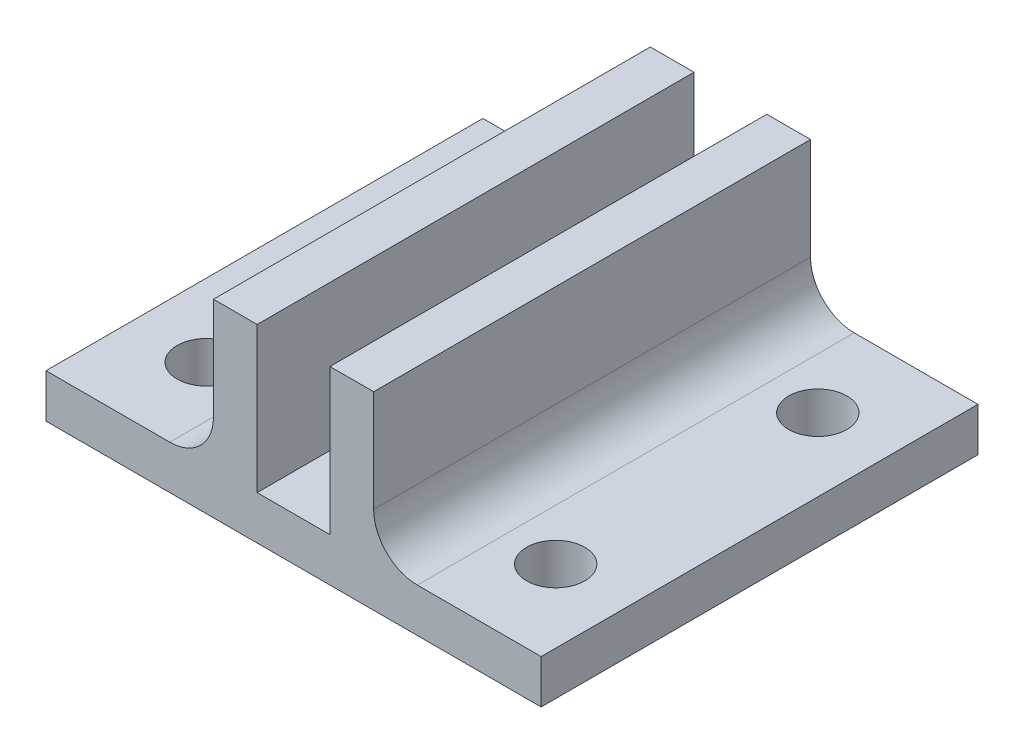
ISO-10303-21;
HEADER;
FILE_DESCRIPTION(('STEP AP214'),'2;1');
FILE_NAME('part.step','',(''),(''),'','','');
FILE_SCHEMA(('AUTOMOTIVE_DESIGN { 1 0 10303 214 1 1 1 1 }'));
ENDSEC;
DATA;
#1=APPLICATION_CONTEXT('core data for automotive mechanical design processes');
#2=APPLICATION_PROTOCOL_DEFINITION('international standard','automotive_design',2000,#1);
#3=PRODUCT_CONTEXT('',#1,'mechanical');
#4=PRODUCT('Part','Part','',(#3));
#5=PRODUCT_RELATED_PRODUCT_CATEGORY('part','',(#4));
#6=PRODUCT_DEFINITION_FORMATION('','',#4);
#7=PRODUCT_DEFINITION_CONTEXT('part definition',#1,'design');
#8=PRODUCT_DEFINITION('design','',#6,#7);
#9=PRODUCT_DEFINITION_SHAPE('','',#8);
#10=(LENGTH_UNIT() NAMED_UNIT(*) SI_UNIT(.MILLI.,.METRE.));
#11=(NAMED_UNIT(*) PLANE_ANGLE_UNIT() SI_UNIT($,.RADIAN.));
#12=(NAMED_UNIT(*) SI_UNIT($,.STERADIAN.) SOLID_ANGLE_UNIT());
#13=UNCERTAINTY_MEASURE_WITH_UNIT(LENGTH_MEASURE(1.E-05),#10,'distance_accuracy_value','');
#14=(GEOMETRIC_REPRESENTATION_CONTEXT(3) GLOBAL_UNCERTAINTY_ASSIGNED_CONTEXT((#13)) GLOBAL_UNIT_ASSIGNED_CONTEXT((#10,
#11,#12)) REPRESENTATION_CONTEXT('',''));
#15=CARTESIAN_POINT('',(0.,0.,0.));
#16=DIRECTION('',(0.,0.,1.));
#17=DIRECTION('',(1.,0.,0.));
#18=AXIS2_PLACEMENT_3D('',#15,#16,#17);
#19=CARTESIAN_POINT('',(11.5,3.,30.));
#20=DIRECTION('',(0.,-1.,0.));
#21=DIRECTION('',(0.,0.,-1.));
#22=AXIS2_PLACEMENT_3D('',#19,#20,#21);
#23=PLANE('',#22);
#24=CARTESIAN_POINT('',(5.,3.,6.));
#25=DIRECTION('',(0.,-1.,0.));
#26=DIRECTION('',(0.,0.,1.));
#27=AXIS2_PLACEMENT_3D('',#24,#25,#26);
#28=CIRCLE('',#27,2.);
#29=CARTESIAN_POINT('',(5.,3.,8.));
#30=VERTEX_POINT('',#29);
#31=EDGE_CURVE('E273',#30,#30,#28,.T.);
#32=ORIENTED_EDGE('',*,*,#31,.T.);
#33=EDGE_LOOP('',(#32));
#34=FACE_BOUND('',#33,.T.);
#35=CARTESIAN_POINT('',(5.,3.,24.));
#36=DIRECTION('',(0.,-1.,0.));
#37=DIRECTION('',(0.,0.,1.));
#38=AXIS2_PLACEMENT_3D('',#35,#36,#37);
#39=CIRCLE('',#38,2.);
#40=CARTESIAN_POINT('',(5.,3.,26.));
#41=VERTEX_POINT('',#40);
#42=EDGE_CURVE('E271',#41,#41,#39,.T.);
#43=ORIENTED_EDGE('',*,*,#42,.T.);
#44=EDGE_LOOP('',(#43));
#45=FACE_BOUND('',#44,.T.);
#46=DIRECTION('',(-1.,0.,0.));
#47=VECTOR('',#46,1.);
#48=CARTESIAN_POINT('',(11.5,3.,30.));
#49=LINE('',#48,#47);
#50=CARTESIAN_POINT('',(8.50000000000001,3.,30.));
#51=VERTEX_POINT('',#50);
#52=CARTESIAN_POINT('',(0.,3.,30.));
#53=VERTEX_POINT('',#52);
#54=EDGE_CURVE('E135',#51,#53,#49,.T.);
#55=ORIENTED_EDGE('',*,*,#54,.F.);
#56=DIRECTION('',(0.,0.,-1.));
#57=VECTOR('',#56,1.);
#58=CARTESIAN_POINT('',(8.50000000000001,3.,0.));
#59=LINE('',#58,#57);
#60=CARTESIAN_POINT('',(8.50000000000001,3.,0.));
#61=VERTEX_POINT('',#60);
#62=EDGE_CURVE('E161',#51,#61,#59,.T.);
#63=ORIENTED_EDGE('',*,*,#62,.T.);
#64=DIRECTION('',(-1.,0.,0.));
#65=VECTOR('',#64,1.);
#66=CARTESIAN_POINT('',(11.5,3.,0.));
#67=LINE('',#66,#65);
#68=CARTESIAN_POINT('',(0.,3.,0.));
#69=VERTEX_POINT('',#68);
#70=EDGE_CURVE('E159',#61,#69,#67,.T.);
#71=ORIENTED_EDGE('',*,*,#70,.T.);
#72=DIRECTION('',(0.,0.,-1.));
#73=VECTOR('',#72,1.);
#74=CARTESIAN_POINT('',(0.,3.,30.));
#75=LINE('',#74,#73);
#76=EDGE_CURVE('E152',#53,#69,#75,.T.);
#77=ORIENTED_EDGE('',*,*,#76,.F.);
#78=EDGE_LOOP('',(#55,#63,#71,#77));
#79=FACE_BOUND('',#78,.T.);
#80=ADVANCED_FACE('F35',(#34,#45,#79),#23,.F.);
#81=CARTESIAN_POINT('',(0.,3.,30.));
#82=DIRECTION('',(1.,0.,0.));
#83=DIRECTION('',(0.,0.,-1.));
#84=AXIS2_PLACEMENT_3D('',#81,#82,#83);
#85=PLANE('',#84);
#86=DIRECTION('',(0.,-1.,0.));
#87=VECTOR('',#86,1.);
#88=CARTESIAN_POINT('',(0.,3.,0.));
#89=LINE('',#88,#87);
#90=CARTESIAN_POINT('',(0.,0.,0.));
#91=VERTEX_POINT('',#90);
#92=EDGE_CURVE('E311',#69,#91,#89,.T.);
#93=ORIENTED_EDGE('',*,*,#92,.T.);
#94=DIRECTION('',(0.,0.,-1.));
#95=VECTOR('',#94,1.);
#96=CARTESIAN_POINT('',(0.,0.,30.));
#97=LINE('',#96,#95);
#98=CARTESIAN_POINT('',(0.,0.,30.));
#99=VERTEX_POINT('',#98);
#100=EDGE_CURVE('E154',#99,#91,#97,.T.);
#101=ORIENTED_EDGE('',*,*,#100,.F.);
#102=DIRECTION('',(0.,-1.,0.));
#103=VECTOR('',#102,1.);
#104=CARTESIAN_POINT('',(0.,3.,30.));
#105=LINE('',#104,#103);
#106=EDGE_CURVE('E139',#53,#99,#105,.T.);
#107=ORIENTED_EDGE('',*,*,#106,.F.);
#108=ORIENTED_EDGE('',*,*,#76,.T.);
#109=EDGE_LOOP('',(#93,#101,#107,#108));
#110=FACE_BOUND('',#109,.T.);
#111=ADVANCED_FACE('F151',(#110),#85,.F.);
#112=CARTESIAN_POINT('',(0.,0.,30.));
#113=DIRECTION('',(0.,1.,0.));
#114=DIRECTION('',(0.,0.,1.));
#115=AXIS2_PLACEMENT_3D('',#112,#113,#114);
#116=PLANE('',#115);
#117=CARTESIAN_POINT('',(5.,0.,6.));
#118=DIRECTION('',(0.,1.,0.));
#119=DIRECTION('',(0.,0.,1.));
#120=AXIS2_PLACEMENT_3D('',#117,#118,#119);
#121=CIRCLE('',#120,2.);
#122=CARTESIAN_POINT('',(5.,0.,8.));
#123=VERTEX_POINT('',#122);
#124=EDGE_CURVE('E276',#123,#123,#121,.T.);
#125=ORIENTED_EDGE('',*,*,#124,.T.);
#126=EDGE_LOOP('',(#125));
#127=FACE_BOUND('',#126,.T.);
#128=CARTESIAN_POINT('',(5.,0.,24.));
#129=DIRECTION('',(0.,1.,0.));
#130=DIRECTION('',(0.,0.,1.));
#131=AXIS2_PLACEMENT_3D('',#128,#129,#130);
#132=CIRCLE('',#131,2.);
#133=CARTESIAN_POINT('',(5.,0.,26.));
#134=VERTEX_POINT('',#133);
#135=EDGE_CURVE('E268',#134,#134,#132,.T.);
#136=ORIENTED_EDGE('',*,*,#135,.T.);
#137=EDGE_LOOP('',(#136));
#138=FACE_BOUND('',#137,.T.);
#139=CARTESIAN_POINT('',(29.,0.,6.));
#140=DIRECTION('',(0.,1.,0.));
#141=DIRECTION('',(0.,0.,1.));
#142=AXIS2_PLACEMENT_3D('',#139,#140,#141);
#143=CIRCLE('',#142,2.);
#144=CARTESIAN_POINT('',(29.,0.,8.));
#145=VERTEX_POINT('',#144);
#146=EDGE_CURVE('E282',#145,#145,#143,.F.);
#147=ORIENTED_EDGE('',*,*,#146,.F.);
#148=EDGE_LOOP('',(#147));
#149=FACE_BOUND('',#148,.T.);
#150=CARTESIAN_POINT('',(29.,0.,24.));
#151=DIRECTION('',(0.,1.,0.));
#152=DIRECTION('',(0.,0.,1.));
#153=AXIS2_PLACEMENT_3D('',#150,#151,#152);
#154=CIRCLE('',#153,2.);
#155=CARTESIAN_POINT('',(29.,0.,26.));
#156=VERTEX_POINT('',#155);
#157=EDGE_CURVE('E283',#156,#156,#154,.F.);
#158=ORIENTED_EDGE('',*,*,#157,.F.);
#159=EDGE_LOOP('',(#158));
#160=FACE_BOUND('',#159,.T.);
#161=DIRECTION('',(1.,0.,0.));
#162=VECTOR('',#161,1.);
#163=CARTESIAN_POINT('',(0.,0.,0.));
#164=LINE('',#163,#162);
#165=CARTESIAN_POINT('',(34.,0.,0.));
#166=VERTEX_POINT('',#165);
#167=EDGE_CURVE('E313',#91,#166,#164,.T.);
#168=ORIENTED_EDGE('',*,*,#167,.T.);
#169=DIRECTION('',(0.,0.,-1.));
#170=VECTOR('',#169,1.);
#171=CARTESIAN_POINT('',(34.,0.,30.));
#172=LINE('',#171,#170);
#173=CARTESIAN_POINT('',(34.,0.,30.));
#174=VERTEX_POINT('',#173);
#175=EDGE_CURVE('E165',#174,#166,#172,.T.);
#176=ORIENTED_EDGE('',*,*,#175,.F.);
#177=DIRECTION('',(1.,0.,0.));
#178=VECTOR('',#177,1.);
#179=CARTESIAN_POINT('',(0.,0.,30.));
#180=LINE('',#179,#178);
#181=EDGE_CURVE('E156',#99,#174,#180,.T.);
#182=ORIENTED_EDGE('',*,*,#181,.F.);
#183=ORIENTED_EDGE('',*,*,#100,.T.);
#184=EDGE_LOOP('',(#168,#176,#182,#183));
#185=FACE_BOUND('',#184,.T.);
#186=ADVANCED_FACE('F207',(#127,#138,#149,#160,#185),#116,.F.);
#187=CARTESIAN_POINT('',(34.,0.,30.));
#188=DIRECTION('',(-1.,0.,0.));
#189=DIRECTION('',(0.,0.,1.));
#190=AXIS2_PLACEMENT_3D('',#187,#188,#189);
#191=PLANE('',#190);
#192=DIRECTION('',(0.,1.,0.));
#193=VECTOR('',#192,1.);
#194=CARTESIAN_POINT('',(34.,0.,0.));
#195=LINE('',#194,#193);
#196=CARTESIAN_POINT('',(34.,3.,0.));
#197=VERTEX_POINT('',#196);
#198=EDGE_CURVE('E315',#166,#197,#195,.T.);
#199=ORIENTED_EDGE('',*,*,#198,.T.);
#200=DIRECTION('',(0.,0.,-1.));
#201=VECTOR('',#200,1.);
#202=CARTESIAN_POINT('',(34.,3.,30.));
#203=LINE('',#202,#201);
#204=CARTESIAN_POINT('',(34.,3.,30.));
#205=VERTEX_POINT('',#204);
#206=EDGE_CURVE('E346',#205,#197,#203,.T.);
#207=ORIENTED_EDGE('',*,*,#206,.F.);
#208=DIRECTION('',(0.,1.,0.));
#209=VECTOR('',#208,1.);
#210=CARTESIAN_POINT('',(34.,0.,30.));
#211=LINE('',#210,#209);
#212=EDGE_CURVE('E292',#174,#205,#211,.T.);
#213=ORIENTED_EDGE('',*,*,#212,.F.);
#214=ORIENTED_EDGE('',*,*,#175,.T.);
#215=EDGE_LOOP('',(#199,#207,#213,#214));
#216=FACE_BOUND('',#215,.T.);
#217=ADVANCED_FACE('F214',(#216),#191,.F.);
#218=CARTESIAN_POINT('',(34.,3.,30.));
#219=DIRECTION('',(0.,-1.,0.));
#220=DIRECTION('',(0.,0.,-1.));
#221=AXIS2_PLACEMENT_3D('',#218,#219,#220);
#222=PLANE('',#221);
#223=CARTESIAN_POINT('',(29.,3.,6.));
#224=DIRECTION('',(0.,1.,0.));
#225=DIRECTION('',(0.,0.,1.));
#226=AXIS2_PLACEMENT_3D('',#223,#224,#225);
#227=CIRCLE('',#226,2.);
#228=CARTESIAN_POINT('',(29.,3.,8.));
#229=VERTEX_POINT('',#228);
#230=EDGE_CURVE('E279',#229,#229,#227,.T.);
#231=ORIENTED_EDGE('',*,*,#230,.F.);
#232=EDGE_LOOP('',(#231));
#233=FACE_BOUND('',#232,.T.);
#234=CARTESIAN_POINT('',(29.,3.,24.));
#235=DIRECTION('',(0.,1.,0.));
#236=DIRECTION('',(0.,0.,1.));
#237=AXIS2_PLACEMENT_3D('',#234,#235,#236);
#238=CIRCLE('',#237,2.);
#239=CARTESIAN_POINT('',(29.,3.,26.));
#240=VERTEX_POINT('',#239);
#241=EDGE_CURVE('E286',#240,#240,#238,.T.);
#242=ORIENTED_EDGE('',*,*,#241,.F.);
#243=EDGE_LOOP('',(#242));
#244=FACE_BOUND('',#243,.T.);
#245=DIRECTION('',(-1.,0.,0.));
#246=VECTOR('',#245,1.);
#247=CARTESIAN_POINT('',(34.,3.,0.));
#248=LINE('',#247,#246);
#249=CARTESIAN_POINT('',(25.5,3.,0.));
#250=VERTEX_POINT('',#249);
#251=EDGE_CURVE('E317',#197,#250,#248,.T.);
#252=ORIENTED_EDGE('',*,*,#251,.T.);
#253=DIRECTION('',(0.,0.,-1.));
#254=VECTOR('',#253,1.);
#255=CARTESIAN_POINT('',(25.5,3.,30.));
#256=LINE('',#255,#254);
#257=CARTESIAN_POINT('',(25.5,3.,30.));
#258=VERTEX_POINT('',#257);
#259=EDGE_CURVE('E50',#250,#258,#256,.F.);
#260=ORIENTED_EDGE('',*,*,#259,.T.);
#261=DIRECTION('',(-1.,0.,0.));
#262=VECTOR('',#261,1.);
#263=CARTESIAN_POINT('',(34.,3.,30.));
#264=LINE('',#263,#262);
#265=EDGE_CURVE('E294',#205,#258,#264,.T.);
#266=ORIENTED_EDGE('',*,*,#265,.F.);
#267=ORIENTED_EDGE('',*,*,#206,.T.);
#268=EDGE_LOOP('',(#252,#260,#266,#267));
#269=FACE_BOUND('',#268,.T.);
#270=ADVANCED_FACE('F218',(#233,#244,#269),#222,.F.);
#271=CARTESIAN_POINT('',(22.5,3.,30.));
#272=DIRECTION('',(-1.,0.,0.));
#273=DIRECTION('',(0.,0.,1.));
#274=AXIS2_PLACEMENT_3D('',#271,#272,#273);
#275=PLANE('',#274);
#276=DIRECTION('',(0.,1.,0.));
#277=VECTOR('',#276,1.);
#278=CARTESIAN_POINT('',(22.5,3.,30.));
#279=LINE('',#278,#277);
#280=CARTESIAN_POINT('',(22.5,6.,30.));
#281=VERTEX_POINT('',#280);
#282=CARTESIAN_POINT('',(22.5,13.,30.));
#283=VERTEX_POINT('',#282);
#284=EDGE_CURVE('E296',#281,#283,#279,.T.);
#285=ORIENTED_EDGE('',*,*,#284,.F.);
#286=DIRECTION('',(0.,0.,-1.));
#287=VECTOR('',#286,1.);
#288=CARTESIAN_POINT('',(22.5,6.,0.));
#289=LINE('',#288,#287);
#290=CARTESIAN_POINT('',(22.5,6.,0.));
#291=VERTEX_POINT('',#290);
#292=EDGE_CURVE('E170',#281,#291,#289,.T.);
#293=ORIENTED_EDGE('',*,*,#292,.T.);
#294=DIRECTION('',(0.,1.,0.));
#295=VECTOR('',#294,1.);
#296=CARTESIAN_POINT('',(22.5,3.,0.));
#297=LINE('',#296,#295);
#298=CARTESIAN_POINT('',(22.5,13.,0.));
#299=VERTEX_POINT('',#298);
#300=EDGE_CURVE('E319',#291,#299,#297,.T.);
#301=ORIENTED_EDGE('',*,*,#300,.T.);
#302=DIRECTION('',(0.,0.,-1.));
#303=VECTOR('',#302,1.);
#304=CARTESIAN_POINT('',(22.5,13.,30.));
#305=LINE('',#304,#303);
#306=EDGE_CURVE('E343',#283,#299,#305,.T.);
#307=ORIENTED_EDGE('',*,*,#306,.F.);
#308=EDGE_LOOP('',(#285,#293,#301,#307));
#309=FACE_BOUND('',#308,.T.);
#310=ADVANCED_FACE('F222',(#309),#275,.F.);
#311=CARTESIAN_POINT('',(19.5,13.,30.));
#312=DIRECTION('',(0.,-1.,0.));
#313=DIRECTION('',(0.,0.,-1.));
#314=AXIS2_PLACEMENT_3D('',#311,#312,#313);
#315=PLANE('',#314);
#316=DIRECTION('',(-1.,0.,0.));
#317=VECTOR('',#316,1.);
#318=CARTESIAN_POINT('',(19.5,13.,0.));
#319=LINE('',#318,#317);
#320=CARTESIAN_POINT('',(19.5,13.,0.));
#321=VERTEX_POINT('',#320);
#322=EDGE_CURVE('E321',#299,#321,#319,.T.);
#323=ORIENTED_EDGE('',*,*,#322,.T.);
#324=DIRECTION('',(0.,0.,-1.));
#325=VECTOR('',#324,1.);
#326=CARTESIAN_POINT('',(19.5,13.,30.));
#327=LINE('',#326,#325);
#328=CARTESIAN_POINT('',(19.5,13.,30.));
#329=VERTEX_POINT('',#328);
#330=EDGE_CURVE('E340',#329,#321,#327,.T.);
#331=ORIENTED_EDGE('',*,*,#330,.F.);
#332=DIRECTION('',(-1.,0.,0.));
#333=VECTOR('',#332,1.);
#334=CARTESIAN_POINT('',(19.5,13.,30.));
#335=LINE('',#334,#333);
#336=EDGE_CURVE('E298',#283,#329,#335,.T.);
#337=ORIENTED_EDGE('',*,*,#336,.F.);
#338=ORIENTED_EDGE('',*,*,#306,.T.);
#339=EDGE_LOOP('',(#323,#331,#337,#338));
#340=FACE_BOUND('',#339,.T.);
#341=ADVANCED_FACE('F226',(#340),#315,.F.);
#342=CARTESIAN_POINT('',(19.5,13.,30.));
#343=DIRECTION('',(1.,0.,0.));
#344=DIRECTION('',(0.,0.,-1.));
#345=AXIS2_PLACEMENT_3D('',#342,#343,#344);
#346=PLANE('',#345);
#347=DIRECTION('',(0.,-1.,0.));
#348=VECTOR('',#347,1.);
#349=CARTESIAN_POINT('',(19.5,13.,0.));
#350=LINE('',#349,#348);
#351=CARTESIAN_POINT('',(19.5,3.,0.));
#352=VERTEX_POINT('',#351);
#353=EDGE_CURVE('E323',#321,#352,#350,.T.);
#354=ORIENTED_EDGE('',*,*,#353,.T.);
#355=DIRECTION('',(0.,0.,-1.));
#356=VECTOR('',#355,1.);
#357=CARTESIAN_POINT('',(19.5,3.,30.));
#358=LINE('',#357,#356);
#359=CARTESIAN_POINT('',(19.5,3.,30.));
#360=VERTEX_POINT('',#359);
#361=EDGE_CURVE('E337',#360,#352,#358,.T.);
#362=ORIENTED_EDGE('',*,*,#361,.F.);
#363=DIRECTION('',(0.,-1.,0.));
#364=VECTOR('',#363,1.);
#365=CARTESIAN_POINT('',(19.5,13.,30.));
#366=LINE('',#365,#364);
#367=EDGE_CURVE('E300',#329,#360,#366,.T.);
#368=ORIENTED_EDGE('',*,*,#367,.F.);
#369=ORIENTED_EDGE('',*,*,#330,.T.);
#370=EDGE_LOOP('',(#354,#362,#368,#369));
#371=FACE_BOUND('',#370,.T.);
#372=ADVANCED_FACE('F230',(#371),#346,.F.);
#373=CARTESIAN_POINT('',(19.5,3.,30.));
#374=DIRECTION('',(0.,-1.,0.));
#375=DIRECTION('',(0.,0.,-1.));
#376=AXIS2_PLACEMENT_3D('',#373,#374,#375);
#377=PLANE('',#376);
#378=DIRECTION('',(-1.,0.,0.));
#379=VECTOR('',#378,1.);
#380=CARTESIAN_POINT('',(19.5,3.,0.));
#381=LINE('',#380,#379);
#382=CARTESIAN_POINT('',(14.5,3.,0.));
#383=VERTEX_POINT('',#382);
#384=EDGE_CURVE('E325',#352,#383,#381,.T.);
#385=ORIENTED_EDGE('',*,*,#384,.T.);
#386=DIRECTION('',(0.,0.,-1.));
#387=VECTOR('',#386,1.);
#388=CARTESIAN_POINT('',(14.5,3.,30.));
#389=LINE('',#388,#387);
#390=CARTESIAN_POINT('',(14.5,3.,30.));
#391=VERTEX_POINT('',#390);
#392=EDGE_CURVE('E334',#391,#383,#389,.T.);
#393=ORIENTED_EDGE('',*,*,#392,.F.);
#394=DIRECTION('',(-1.,0.,0.));
#395=VECTOR('',#394,1.);
#396=CARTESIAN_POINT('',(19.5,3.,30.));
#397=LINE('',#396,#395);
#398=EDGE_CURVE('E302',#360,#391,#397,.T.);
#399=ORIENTED_EDGE('',*,*,#398,.F.);
#400=ORIENTED_EDGE('',*,*,#361,.T.);
#401=EDGE_LOOP('',(#385,#393,#399,#400));
#402=FACE_BOUND('',#401,.T.);
#403=ADVANCED_FACE('F234',(#402),#377,.F.);
#404=CARTESIAN_POINT('',(14.5,3.,30.));
#405=DIRECTION('',(-1.,0.,0.));
#406=DIRECTION('',(0.,0.,1.));
#407=AXIS2_PLACEMENT_3D('',#404,#405,#406);
#408=PLANE('',#407);
#409=DIRECTION('',(0.,1.,0.));
#410=VECTOR('',#409,1.);
#411=CARTESIAN_POINT('',(14.5,3.,0.));
#412=LINE('',#411,#410);
#413=CARTESIAN_POINT('',(14.5,13.,0.));
#414=VERTEX_POINT('',#413);
#415=EDGE_CURVE('E327',#383,#414,#412,.T.);
#416=ORIENTED_EDGE('',*,*,#415,.T.);
#417=DIRECTION('',(0.,0.,-1.));
#418=VECTOR('',#417,1.);
#419=CARTESIAN_POINT('',(14.5,13.,30.));
#420=LINE('',#419,#418);
#421=CARTESIAN_POINT('',(14.5,13.,30.));
#422=VERTEX_POINT('',#421);
#423=EDGE_CURVE('E331',#422,#414,#420,.T.);
#424=ORIENTED_EDGE('',*,*,#423,.F.);
#425=DIRECTION('',(0.,1.,0.));
#426=VECTOR('',#425,1.);
#427=CARTESIAN_POINT('',(14.5,3.,30.));
#428=LINE('',#427,#426);
#429=EDGE_CURVE('E304',#391,#422,#428,.T.);
#430=ORIENTED_EDGE('',*,*,#429,.F.);
#431=ORIENTED_EDGE('',*,*,#392,.T.);
#432=EDGE_LOOP('',(#416,#424,#430,#431));
#433=FACE_BOUND('',#432,.T.);
#434=ADVANCED_FACE('F238',(#433),#408,.F.);
#435=CARTESIAN_POINT('',(11.5,13.,30.));
#436=DIRECTION('',(0.,-1.,0.));
#437=DIRECTION('',(0.,0.,-1.));
#438=AXIS2_PLACEMENT_3D('',#435,#436,#437);
#439=PLANE('',#438);
#440=DIRECTION('',(-1.,0.,0.));
#441=VECTOR('',#440,1.);
#442=CARTESIAN_POINT('',(11.5,13.,0.));
#443=LINE('',#442,#441);
#444=CARTESIAN_POINT('',(11.5,13.,0.));
#445=VERTEX_POINT('',#444);
#446=EDGE_CURVE('E188',#414,#445,#443,.T.);
#447=ORIENTED_EDGE('',*,*,#446,.T.);
#448=DIRECTION('',(0.,0.,-1.));
#449=VECTOR('',#448,1.);
#450=CARTESIAN_POINT('',(11.5,13.,30.));
#451=LINE('',#450,#449);
#452=CARTESIAN_POINT('',(11.5,13.,30.));
#453=VERTEX_POINT('',#452);
#454=EDGE_CURVE('E187',#453,#445,#451,.T.);
#455=ORIENTED_EDGE('',*,*,#454,.F.);
#456=DIRECTION('',(-1.,0.,0.));
#457=VECTOR('',#456,1.);
#458=CARTESIAN_POINT('',(11.5,13.,30.));
#459=LINE('',#458,#457);
#460=EDGE_CURVE('E306',#422,#453,#459,.T.);
#461=ORIENTED_EDGE('',*,*,#460,.F.);
#462=ORIENTED_EDGE('',*,*,#423,.T.);
#463=EDGE_LOOP('',(#447,#455,#461,#462));
#464=FACE_BOUND('',#463,.T.);
#465=ADVANCED_FACE('F242',(#464),#439,.F.);
#466=CARTESIAN_POINT('',(11.5,3.,30.));
#467=DIRECTION('',(1.,0.,0.));
#468=DIRECTION('',(0.,0.,-1.));
#469=AXIS2_PLACEMENT_3D('',#466,#467,#468);
#470=PLANE('',#469);
#471=DIRECTION('',(0.,-1.,0.));
#472=VECTOR('',#471,1.);
#473=CARTESIAN_POINT('',(11.5,3.,0.));
#474=LINE('',#473,#472);
#475=CARTESIAN_POINT('',(11.5,6.,0.));
#476=VERTEX_POINT('',#475);
#477=EDGE_CURVE('E147',#445,#476,#474,.T.);
#478=ORIENTED_EDGE('',*,*,#477,.T.);
#479=DIRECTION('',(0.,0.,-1.));
#480=VECTOR('',#479,1.);
#481=CARTESIAN_POINT('',(11.5,6.,30.));
#482=LINE('',#481,#480);
#483=CARTESIAN_POINT('',(11.5,6.,30.));
#484=VERTEX_POINT('',#483);
#485=EDGE_CURVE('E163',#476,#484,#482,.F.);
#486=ORIENTED_EDGE('',*,*,#485,.T.);
#487=DIRECTION('',(0.,-1.,0.));
#488=VECTOR('',#487,1.);
#489=CARTESIAN_POINT('',(11.5,3.,30.));
#490=LINE('',#489,#488);
#491=EDGE_CURVE('E308',#453,#484,#490,.T.);
#492=ORIENTED_EDGE('',*,*,#491,.F.);
#493=ORIENTED_EDGE('',*,*,#454,.T.);
#494=EDGE_LOOP('',(#478,#486,#492,#493));
#495=FACE_BOUND('',#494,.T.);
#496=ADVANCED_FACE('F184',(#495),#470,.F.);
#497=CARTESIAN_POINT('',(0.,0.,30.));
#498=DIRECTION('',(0.,0.,1.));
#499=DIRECTION('',(1.,0.,0.));
#500=AXIS2_PLACEMENT_3D('',#497,#498,#499);
#501=PLANE('',#500);
#502=ORIENTED_EDGE('',*,*,#491,.T.);
#503=CARTESIAN_POINT('',(8.50000000000001,6.,30.));
#504=DIRECTION('',(0.,0.,1.));
#505=DIRECTION('',(1.,0.,0.));
#506=AXIS2_PLACEMENT_3D('',#503,#504,#505);
#507=CIRCLE('',#506,3.);
#508=EDGE_CURVE('E142',#484,#51,#507,.F.);
#509=ORIENTED_EDGE('',*,*,#508,.T.);
#510=ORIENTED_EDGE('',*,*,#54,.T.);
#511=ORIENTED_EDGE('',*,*,#106,.T.);
#512=ORIENTED_EDGE('',*,*,#181,.T.);
#513=ORIENTED_EDGE('',*,*,#212,.T.);
#514=ORIENTED_EDGE('',*,*,#265,.T.);
#515=CARTESIAN_POINT('',(25.5,6.,30.));
#516=DIRECTION('',(0.,0.,1.));
#517=DIRECTION('',(1.,0.,0.));
#518=AXIS2_PLACEMENT_3D('',#515,#516,#517);
#519=CIRCLE('',#518,3.);
#520=EDGE_CURVE('E11',#258,#281,#519,.F.);
#521=ORIENTED_EDGE('',*,*,#520,.T.);
#522=ORIENTED_EDGE('',*,*,#284,.T.);
#523=ORIENTED_EDGE('',*,*,#336,.T.);
#524=ORIENTED_EDGE('',*,*,#367,.T.);
#525=ORIENTED_EDGE('',*,*,#398,.T.);
#526=ORIENTED_EDGE('',*,*,#429,.T.);
#527=ORIENTED_EDGE('',*,*,#460,.T.);
#528=EDGE_LOOP('',(#502,#509,#510,#511,#512,#513,#514,#521,#522,#523,#524,#525,#526,#527));
#529=FACE_BOUND('',#528,.T.);
#530=ADVANCED_FACE('F138',(#529),#501,.T.);
#531=CARTESIAN_POINT('',(0.,0.,0.));
#532=DIRECTION('',(0.,0.,1.));
#533=DIRECTION('',(1.,0.,0.));
#534=AXIS2_PLACEMENT_3D('',#531,#532,#533);
#535=PLANE('',#534);
#536=ORIENTED_EDGE('',*,*,#70,.F.);
#537=CARTESIAN_POINT('',(8.50000000000001,6.,0.));
#538=DIRECTION('',(0.,0.,1.));
#539=DIRECTION('',(1.,0.,0.));
#540=AXIS2_PLACEMENT_3D('',#537,#538,#539);
#541=CIRCLE('',#540,3.);
#542=EDGE_CURVE('E174',#61,#476,#541,.T.);
#543=ORIENTED_EDGE('',*,*,#542,.T.);
#544=ORIENTED_EDGE('',*,*,#477,.F.);
#545=ORIENTED_EDGE('',*,*,#446,.F.);
#546=ORIENTED_EDGE('',*,*,#415,.F.);
#547=ORIENTED_EDGE('',*,*,#384,.F.);
#548=ORIENTED_EDGE('',*,*,#353,.F.);
#549=ORIENTED_EDGE('',*,*,#322,.F.);
#550=ORIENTED_EDGE('',*,*,#300,.F.);
#551=CARTESIAN_POINT('',(25.5,6.,0.));
#552=DIRECTION('',(0.,0.,1.));
#553=DIRECTION('',(1.,0.,0.));
#554=AXIS2_PLACEMENT_3D('',#551,#552,#553);
#555=CIRCLE('',#554,3.);
#556=EDGE_CURVE('E43',#291,#250,#555,.T.);
#557=ORIENTED_EDGE('',*,*,#556,.T.);
#558=ORIENTED_EDGE('',*,*,#251,.F.);
#559=ORIENTED_EDGE('',*,*,#198,.F.);
#560=ORIENTED_EDGE('',*,*,#167,.F.);
#561=ORIENTED_EDGE('',*,*,#92,.F.);
#562=EDGE_LOOP('',(#536,#543,#544,#545,#546,#547,#548,#549,#550,#557,#558,#559,#560,#561));
#563=FACE_BOUND('',#562,.T.);
#564=ADVANCED_FACE('F178',(#563),#535,.F.);
#565=CARTESIAN_POINT('',(29.,-5.65685424949237,24.));
#566=DIRECTION('',(0.,1.,0.));
#567=DIRECTION('',(0.,0.,1.));
#568=AXIS2_PLACEMENT_3D('',#565,#566,#567);
#569=CYLINDRICAL_SURFACE('',#568,2.);
#570=CARTESIAN_POINT('',(29.,0.,26.));
#571=CARTESIAN_POINT('',(29.,0.0312499999999992,26.));
#572=CARTESIAN_POINT('',(29.,0.0624999999999992,26.));
#573=CARTESIAN_POINT('',(29.,0.124999999999999,26.));
#574=CARTESIAN_POINT('',(29.,0.156249999999999,26.));
#575=CARTESIAN_POINT('',(29.,0.218749999999999,26.));
#576=CARTESIAN_POINT('',(29.,0.249999999999999,26.));
#577=CARTESIAN_POINT('',(29.,0.312499999999999,26.));
#578=CARTESIAN_POINT('',(29.,0.343749999999999,26.));
#579=CARTESIAN_POINT('',(29.,0.40625,26.));
#580=CARTESIAN_POINT('',(29.,0.4375,26.));
#581=CARTESIAN_POINT('',(29.,0.5,26.));
#582=CARTESIAN_POINT('',(29.,0.53125,26.));
#583=CARTESIAN_POINT('',(29.,0.59375,26.));
#584=CARTESIAN_POINT('',(29.,0.625,26.));
#585=CARTESIAN_POINT('',(29.,0.6875,26.));
#586=CARTESIAN_POINT('',(29.,0.71875,26.));
#587=CARTESIAN_POINT('',(29.,0.78125,26.));
#588=CARTESIAN_POINT('',(29.,0.8125,26.));
#589=CARTESIAN_POINT('',(29.,0.875,26.));
#590=CARTESIAN_POINT('',(29.,0.90625,26.));
#591=CARTESIAN_POINT('',(29.,0.96875,26.));
#592=CARTESIAN_POINT('',(29.,1.,26.));
#593=CARTESIAN_POINT('',(29.,1.0625,26.));
#594=CARTESIAN_POINT('',(29.,1.09375,26.));
#595=CARTESIAN_POINT('',(29.,1.15625,26.));
#596=CARTESIAN_POINT('',(29.,1.1875,26.));
#597=CARTESIAN_POINT('',(29.,1.25,26.));
#598=CARTESIAN_POINT('',(29.,1.28125,26.));
#599=CARTESIAN_POINT('',(29.,1.34375,26.));
#600=CARTESIAN_POINT('',(29.,1.375,26.));
#601=CARTESIAN_POINT('',(29.,1.4375,26.));
#602=CARTESIAN_POINT('',(29.,1.46875,26.));
#603=CARTESIAN_POINT('',(29.,1.53125,26.));
#604=CARTESIAN_POINT('',(29.,1.5625,26.));
#605=CARTESIAN_POINT('',(29.,1.625,26.));
#606=CARTESIAN_POINT('',(29.,1.65625,26.));
#607=CARTESIAN_POINT('',(29.,1.71875,26.));
#608=CARTESIAN_POINT('',(29.,1.75,26.));
#609=CARTESIAN_POINT('',(29.,1.8125,26.));
#610=CARTESIAN_POINT('',(29.,1.84375,26.));
#611=CARTESIAN_POINT('',(29.,1.90625,26.));
#612=CARTESIAN_POINT('',(29.,1.9375,26.));
#613=CARTESIAN_POINT('',(29.,2.,26.));
#614=CARTESIAN_POINT('',(29.,2.03125,26.));
#615=CARTESIAN_POINT('',(29.,2.09375,26.));
#616=CARTESIAN_POINT('',(29.,2.125,26.));
#617=CARTESIAN_POINT('',(29.,2.1875,26.));
#618=CARTESIAN_POINT('',(29.,2.21875,26.));
#619=CARTESIAN_POINT('',(29.,2.28125,26.));
#620=CARTESIAN_POINT('',(29.,2.3125,26.));
#621=CARTESIAN_POINT('',(29.,2.375,26.));
#622=CARTESIAN_POINT('',(29.,2.40625,26.));
#623=CARTESIAN_POINT('',(29.,2.46875,26.));
#624=CARTESIAN_POINT('',(29.,2.5,26.));
#625=CARTESIAN_POINT('',(29.,2.5625,26.));
#626=CARTESIAN_POINT('',(29.,2.59375,26.));
#627=CARTESIAN_POINT('',(29.,2.65625,26.));
#628=CARTESIAN_POINT('',(29.,2.6875,26.));
#629=CARTESIAN_POINT('',(29.,2.75,26.));
#630=CARTESIAN_POINT('',(29.,2.78125,26.));
#631=CARTESIAN_POINT('',(29.,2.84375,26.));
#632=CARTESIAN_POINT('',(29.,2.875,26.));
#633=CARTESIAN_POINT('',(29.,2.9375,26.));
#634=CARTESIAN_POINT('',(29.,2.96875,26.));
#635=CARTESIAN_POINT('',(29.,3.,26.));
#636=B_SPLINE_CURVE_WITH_KNOTS('',3,(#570,#571,#572,#573,#574,#575,#576,#577,#578,#579,#580,
#581,#582,#583,#584,#585,#586,#587,#588,#589,#590,#591,#592,#593,#594,#595,#596,#597,#598,#599,
#600,#601,#602,#603,#604,#605,#606,#607,#608,#609,#610,#611,#612,#613,#614,#615,#616,#617,#618,
#619,#620,#621,#622,#623,#624,#625,#626,#627,#628,#629,#630,#631,#632,#633,#634,#635),
.UNSPECIFIED.,.F.,.F.,(4,2,2,2,2,2,2,2,2,2,2,2,2,2,2,2,2,2,2,2,2,2,2,2,2,2,2,2,2,2,2,2,4),(0.,
0.0937500000000001,0.1875,0.28125,0.375,0.46875,0.5625,0.656250000000001,0.750000000000001,
0.843750000000001,0.937500000000001,1.03125,1.125,1.21875,1.3125,1.40625,1.5,1.59375,1.6875,
1.78125,1.875,1.96875,2.0625,2.15625,2.25,2.34375,2.4375,2.53125,2.625,2.71875,2.8125,2.90625,
3.),.UNSPECIFIED.);
#637=EDGE_CURVE('BSEAM251',#156,#240,#636,.T.);
#638=ORIENTED_EDGE('',*,*,#157,.T.);
#639=ORIENTED_EDGE('',*,*,#241,.T.);
#640=ORIENTED_EDGE('',*,*,#637,.T.);
#641=ORIENTED_EDGE('',*,*,#637,.F.);
#642=EDGE_LOOP('',(#638,#640,#639,#641));
#643=FACE_BOUND('',#642,.T.);
#644=ADVANCED_FACE('F251',(#643),#569,.F.);
#645=CARTESIAN_POINT('',(29.,-5.65685424949237,6.));
#646=DIRECTION('',(0.,1.,0.));
#647=DIRECTION('',(0.,0.,1.));
#648=AXIS2_PLACEMENT_3D('',#645,#646,#647);
#649=CYLINDRICAL_SURFACE('',#648,2.);
#650=CARTESIAN_POINT('',(29.,0.,8.));
#651=CARTESIAN_POINT('',(29.,0.0312499999999992,8.));
#652=CARTESIAN_POINT('',(29.,0.0624999999999992,8.));
#653=CARTESIAN_POINT('',(29.,0.124999999999999,8.));
#654=CARTESIAN_POINT('',(29.,0.156249999999999,8.));
#655=CARTESIAN_POINT('',(29.,0.218749999999999,8.));
#656=CARTESIAN_POINT('',(29.,0.249999999999999,8.));
#657=CARTESIAN_POINT('',(29.,0.312499999999999,8.));
#658=CARTESIAN_POINT('',(29.,0.343749999999999,8.));
#659=CARTESIAN_POINT('',(29.,0.40625,8.));
#660=CARTESIAN_POINT('',(29.,0.4375,8.));
#661=CARTESIAN_POINT('',(29.,0.5,8.));
#662=CARTESIAN_POINT('',(29.,0.53125,8.));
#663=CARTESIAN_POINT('',(29.,0.59375,8.));
#664=CARTESIAN_POINT('',(29.,0.625,8.));
#665=CARTESIAN_POINT('',(29.,0.6875,8.));
#666=CARTESIAN_POINT('',(29.,0.71875,8.));
#667=CARTESIAN_POINT('',(29.,0.78125,8.));
#668=CARTESIAN_POINT('',(29.,0.8125,8.));
#669=CARTESIAN_POINT('',(29.,0.875,8.));
#670=CARTESIAN_POINT('',(29.,0.90625,8.));
#671=CARTESIAN_POINT('',(29.,0.96875,8.));
#672=CARTESIAN_POINT('',(29.,1.,8.));
#673=CARTESIAN_POINT('',(29.,1.0625,8.));
#674=CARTESIAN_POINT('',(29.,1.09375,8.));
#675=CARTESIAN_POINT('',(29.,1.15625,8.));
#676=CARTESIAN_POINT('',(29.,1.1875,8.));
#677=CARTESIAN_POINT('',(29.,1.25,8.));
#678=CARTESIAN_POINT('',(29.,1.28125,8.));
#679=CARTESIAN_POINT('',(29.,1.34375,8.));
#680=CARTESIAN_POINT('',(29.,1.375,8.));
#681=CARTESIAN_POINT('',(29.,1.4375,8.));
#682=CARTESIAN_POINT('',(29.,1.46875,8.));
#683=CARTESIAN_POINT('',(29.,1.53125,8.));
#684=CARTESIAN_POINT('',(29.,1.5625,8.));
#685=CARTESIAN_POINT('',(29.,1.625,8.));
#686=CARTESIAN_POINT('',(29.,1.65625,8.));
#687=CARTESIAN_POINT('',(29.,1.71875,8.));
#688=CARTESIAN_POINT('',(29.,1.75,8.));
#689=CARTESIAN_POINT('',(29.,1.8125,8.));
#690=CARTESIAN_POINT('',(29.,1.84375,8.));
#691=CARTESIAN_POINT('',(29.,1.90625,8.));
#692=CARTESIAN_POINT('',(29.,1.9375,8.));
#693=CARTESIAN_POINT('',(29.,2.,8.));
#694=CARTESIAN_POINT('',(29.,2.03125,8.));
#695=CARTESIAN_POINT('',(29.,2.09375,8.));
#696=CARTESIAN_POINT('',(29.,2.125,8.));
#697=CARTESIAN_POINT('',(29.,2.1875,8.));
#698=CARTESIAN_POINT('',(29.,2.21875,8.));
#699=CARTESIAN_POINT('',(29.,2.28125,8.));
#700=CARTESIAN_POINT('',(29.,2.3125,8.));
#701=CARTESIAN_POINT('',(29.,2.375,8.));
#702=CARTESIAN_POINT('',(29.,2.40625,8.));
#703=CARTESIAN_POINT('',(29.,2.46875,8.));
#704=CARTESIAN_POINT('',(29.,2.5,8.));
#705=CARTESIAN_POINT('',(29.,2.5625,8.));
#706=CARTESIAN_POINT('',(29.,2.59375,8.));
#707=CARTESIAN_POINT('',(29.,2.65625,8.));
#708=CARTESIAN_POINT('',(29.,2.6875,8.));
#709=CARTESIAN_POINT('',(29.,2.75,8.));
#710=CARTESIAN_POINT('',(29.,2.78125,8.));
#711=CARTESIAN_POINT('',(29.,2.84375,8.));
#712=CARTESIAN_POINT('',(29.,2.875,8.));
#713=CARTESIAN_POINT('',(29.,2.9375,8.));
#714=CARTESIAN_POINT('',(29.,2.96875,8.));
#715=CARTESIAN_POINT('',(29.,3.,8.));
#716=B_SPLINE_CURVE_WITH_KNOTS('',3,(#650,#651,#652,#653,#654,#655,#656,#657,#658,#659,#660,
#661,#662,#663,#664,#665,#666,#667,#668,#669,#670,#671,#672,#673,#674,#675,#676,#677,#678,#679,
#680,#681,#682,#683,#684,#685,#686,#687,#688,#689,#690,#691,#692,#693,#694,#695,#696,#697,#698,
#699,#700,#701,#702,#703,#704,#705,#706,#707,#708,#709,#710,#711,#712,#713,#714,#715),
.UNSPECIFIED.,.F.,.F.,(4,2,2,2,2,2,2,2,2,2,2,2,2,2,2,2,2,2,2,2,2,2,2,2,2,2,2,2,2,2,2,2,4),(0.,
0.0937500000000001,0.1875,0.28125,0.375,0.46875,0.5625,0.656250000000001,0.750000000000001,
0.843750000000001,0.937500000000001,1.03125,1.125,1.21875,1.3125,1.40625,1.5,1.59375,1.6875,
1.78125,1.875,1.96875,2.0625,2.15625,2.25,2.34375,2.4375,2.53125,2.625,2.71875,2.8125,2.90625,
3.),.UNSPECIFIED.);
#717=EDGE_CURVE('BSEAM256',#145,#229,#716,.T.);
#718=ORIENTED_EDGE('',*,*,#146,.T.);
#719=ORIENTED_EDGE('',*,*,#230,.T.);
#720=ORIENTED_EDGE('',*,*,#717,.T.);
#721=ORIENTED_EDGE('',*,*,#717,.F.);
#722=EDGE_LOOP('',(#718,#720,#719,#721));
#723=FACE_BOUND('',#722,.T.);
#724=ADVANCED_FACE('F256',(#723),#649,.F.);
#725=CARTESIAN_POINT('',(5.,-5.65685424949237,24.));
#726=DIRECTION('',(0.,1.,0.));
#727=DIRECTION('',(0.,0.,1.));
#728=AXIS2_PLACEMENT_3D('',#725,#726,#727);
#729=CYLINDRICAL_SURFACE('',#728,2.);
#730=ORIENTED_EDGE('',*,*,#135,.F.);
#731=EDGE_LOOP('',(#730));
#732=FACE_BOUND('',#731,.T.);
#733=ORIENTED_EDGE('',*,*,#42,.F.);
#734=EDGE_LOOP('',(#733));
#735=FACE_BOUND('',#734,.T.);
#736=ADVANCED_FACE('F198',(#732,#735),#729,.F.);
#737=CARTESIAN_POINT('',(5.,-5.65685424949237,6.));
#738=DIRECTION('',(0.,1.,0.));
#739=DIRECTION('',(0.,0.,1.));
#740=AXIS2_PLACEMENT_3D('',#737,#738,#739);
#741=CYLINDRICAL_SURFACE('',#740,2.);
#742=ORIENTED_EDGE('',*,*,#124,.F.);
#743=EDGE_LOOP('',(#742));
#744=FACE_BOUND('',#743,.T.);
#745=ORIENTED_EDGE('',*,*,#31,.F.);
#746=EDGE_LOOP('',(#745));
#747=FACE_BOUND('',#746,.T.);
#748=ADVANCED_FACE('F192',(#744,#747),#741,.F.);
#749=CARTESIAN_POINT('',(8.50000000000001,6.,30.));
#750=DIRECTION('',(0.,0.,1.));
#751=DIRECTION('',(1.,0.,0.));
#752=AXIS2_PLACEMENT_3D('',#749,#750,#751);
#753=CYLINDRICAL_SURFACE('',#752,3.);
#754=ORIENTED_EDGE('',*,*,#508,.F.);
#755=ORIENTED_EDGE('',*,*,#485,.F.);
#756=ORIENTED_EDGE('',*,*,#542,.F.);
#757=ORIENTED_EDGE('',*,*,#62,.F.);
#758=EDGE_LOOP('',(#754,#755,#756,#757));
#759=FACE_BOUND('',#758,.T.);
#760=ADVANCED_FACE('F190',(#759),#753,.F.);
#761=CARTESIAN_POINT('',(25.5,6.,30.));
#762=DIRECTION('',(0.,0.,1.));
#763=DIRECTION('',(1.,0.,0.));
#764=AXIS2_PLACEMENT_3D('',#761,#762,#763);
#765=CYLINDRICAL_SURFACE('',#764,3.);
#766=ORIENTED_EDGE('',*,*,#520,.F.);
#767=ORIENTED_EDGE('',*,*,#259,.F.);
#768=ORIENTED_EDGE('',*,*,#556,.F.);
#769=ORIENTED_EDGE('',*,*,#292,.F.);
#770=EDGE_LOOP('',(#766,#767,#768,#769));
#771=FACE_BOUND('',#770,.T.);
#772=ADVANCED_FACE('F37',(#771),#765,.F.);
#773=CLOSED_SHELL('',(#80,#111,#186,#217,#270,#310,#341,#372,#403,#434,#465,#496,#530,#564,#644,
#724,#736,#748,#760,#772));
#774=MANIFOLD_SOLID_BREP('B2',#773);
#775=ADVANCED_BREP_SHAPE_REPRESENTATION('',(#18,#774),#14);
#776=SHAPE_DEFINITION_REPRESENTATION(#9,#775);
ENDSEC;
END-ISO-10303-21;
